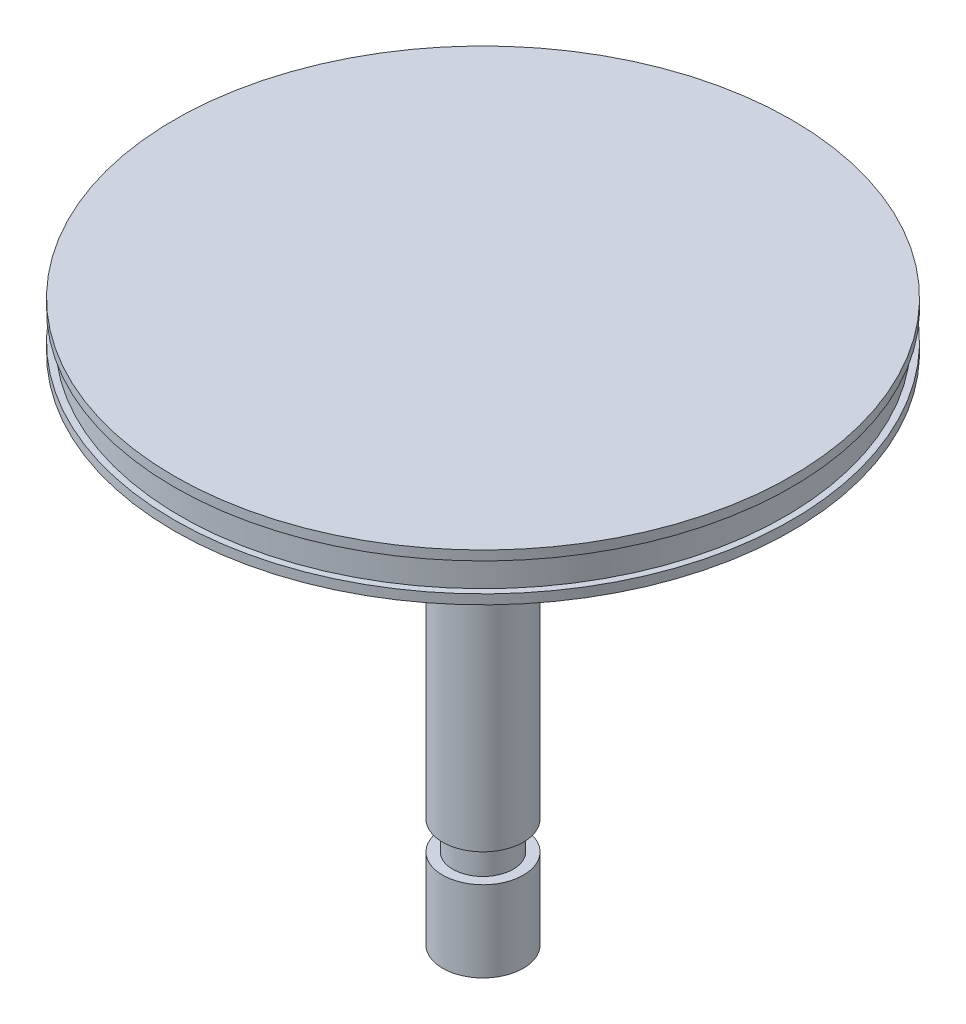
ISO-10303-21;
HEADER;
FILE_DESCRIPTION(('STEP AP214'),'2;1');
FILE_NAME('part.step','',(''),(''),'','','');
FILE_SCHEMA(('AUTOMOTIVE_DESIGN { 1 0 10303 214 1 1 1 1 }'));
ENDSEC;
DATA;
#1=APPLICATION_CONTEXT('core data for automotive mechanical design processes');
#2=APPLICATION_PROTOCOL_DEFINITION('international standard','automotive_design',2000,#1);
#3=PRODUCT_CONTEXT('',#1,'mechanical');
#4=PRODUCT('Part','Part','',(#3));
#5=PRODUCT_RELATED_PRODUCT_CATEGORY('part','',(#4));
#6=PRODUCT_DEFINITION_FORMATION('','',#4);
#7=PRODUCT_DEFINITION_CONTEXT('part definition',#1,'design');
#8=PRODUCT_DEFINITION('design','',#6,#7);
#9=PRODUCT_DEFINITION_SHAPE('','',#8);
#10=(LENGTH_UNIT() NAMED_UNIT(*) SI_UNIT(.MILLI.,.METRE.));
#11=(NAMED_UNIT(*) PLANE_ANGLE_UNIT() SI_UNIT($,.RADIAN.));
#12=(NAMED_UNIT(*) SI_UNIT($,.STERADIAN.) SOLID_ANGLE_UNIT());
#13=UNCERTAINTY_MEASURE_WITH_UNIT(LENGTH_MEASURE(1.E-05),#10,'distance_accuracy_value','');
#14=(GEOMETRIC_REPRESENTATION_CONTEXT(3) GLOBAL_UNCERTAINTY_ASSIGNED_CONTEXT((#13)) GLOBAL_UNIT_ASSIGNED_CONTEXT((#10,
#11,#12)) REPRESENTATION_CONTEXT('',''));
#15=CARTESIAN_POINT('',(0.,0.,0.));
#16=DIRECTION('',(0.,0.,1.));
#17=DIRECTION('',(1.,0.,0.));
#18=AXIS2_PLACEMENT_3D('',#15,#16,#17);
#19=CARTESIAN_POINT('',(0.,-113.,0.));
#20=DIRECTION('',(0.,1.,0.));
#21=DIRECTION('',(0.,0.,1.));
#22=AXIS2_PLACEMENT_3D('',#19,#20,#21);
#23=CYLINDRICAL_SURFACE('',#22,6.366);
#24=CARTESIAN_POINT('',(0.,-24.,0.));
#25=DIRECTION('',(0.,-1.,0.));
#26=DIRECTION('',(0.,0.,-1.));
#27=AXIS2_PLACEMENT_3D('',#24,#25,#26);
#28=CIRCLE('',#27,6.366);
#29=CARTESIAN_POINT('',(0.,-24.,-6.366));
#30=VERTEX_POINT('',#29);
#31=EDGE_CURVE('E47',#30,#30,#28,.T.);
#32=ORIENTED_EDGE('',*,*,#31,.T.);
#33=EDGE_LOOP('',(#32));
#34=FACE_BOUND('',#33,.T.);
#35=CARTESIAN_POINT('',(0.,-30.,0.));
#36=DIRECTION('',(0.,-1.,0.));
#37=DIRECTION('',(0.,0.,-1.));
#38=AXIS2_PLACEMENT_3D('',#35,#36,#37);
#39=CIRCLE('',#38,6.366);
#40=CARTESIAN_POINT('',(0.,-30.,-6.366));
#41=VERTEX_POINT('',#40);
#42=EDGE_CURVE('E10',#41,#41,#39,.T.);
#43=ORIENTED_EDGE('',*,*,#42,.F.);
#44=EDGE_LOOP('',(#43));
#45=FACE_BOUND('',#44,.T.);
#46=ADVANCED_FACE('F32',(#34,#45),#23,.T.);
#47=CARTESIAN_POINT('',(0.,5.,0.));
#48=DIRECTION('',(0.,-1.,0.));
#49=DIRECTION('',(0.,0.,-1.));
#50=AXIS2_PLACEMENT_3D('',#47,#48,#49);
#51=CYLINDRICAL_SURFACE('',#50,63.66);
#52=CARTESIAN_POINT('',(0.,-3.,0.));
#53=DIRECTION('',(0.,-1.,0.));
#54=DIRECTION('',(0.,0.,-1.));
#55=AXIS2_PLACEMENT_3D('',#52,#53,#54);
#56=CIRCLE('',#55,63.66);
#57=CARTESIAN_POINT('',(0.,-3.,-63.66));
#58=VERTEX_POINT('',#57);
#59=EDGE_CURVE('E57',#58,#58,#56,.T.);
#60=ORIENTED_EDGE('',*,*,#59,.F.);
#61=EDGE_LOOP('',(#60));
#62=FACE_BOUND('',#61,.T.);
#63=CARTESIAN_POINT('',(0.,3.,0.));
#64=DIRECTION('',(0.,1.,0.));
#65=DIRECTION('',(0.,0.,1.));
#66=AXIS2_PLACEMENT_3D('',#63,#64,#65);
#67=CIRCLE('',#66,63.66);
#68=CARTESIAN_POINT('',(0.,3.,63.66));
#69=VERTEX_POINT('',#68);
#70=EDGE_CURVE('E54',#69,#69,#67,.T.);
#71=ORIENTED_EDGE('',*,*,#70,.F.);
#72=EDGE_LOOP('',(#71));
#73=FACE_BOUND('',#72,.T.);
#74=ADVANCED_FACE('F34',(#62,#73),#51,.T.);
#75=CARTESIAN_POINT('',(0.,-3.,0.));
#76=DIRECTION('',(0.,-1.,0.));
#77=DIRECTION('',(0.,0.,-1.));
#78=AXIS2_PLACEMENT_3D('',#75,#76,#77);
#79=CYLINDRICAL_SURFACE('',#78,65.);
#80=CARTESIAN_POINT('',(0.,-3.,0.));
#81=DIRECTION('',(0.,-1.,0.));
#82=DIRECTION('',(0.,0.,-1.));
#83=AXIS2_PLACEMENT_3D('',#80,#81,#82);
#84=CIRCLE('',#83,65.);
#85=CARTESIAN_POINT('',(0.,-3.,-65.));
#86=VERTEX_POINT('',#85);
#87=EDGE_CURVE('E60',#86,#86,#84,.T.);
#88=ORIENTED_EDGE('',*,*,#87,.T.);
#89=EDGE_LOOP('',(#88));
#90=FACE_BOUND('',#89,.T.);
#91=CARTESIAN_POINT('',(0.,-5.,0.));
#92=DIRECTION('',(0.,-1.,0.));
#93=DIRECTION('',(0.,0.,-1.));
#94=AXIS2_PLACEMENT_3D('',#91,#92,#93);
#95=CIRCLE('',#94,65.);
#96=CARTESIAN_POINT('',(0.,-5.,-65.));
#97=VERTEX_POINT('',#96);
#98=EDGE_CURVE('E61',#97,#97,#95,.T.);
#99=ORIENTED_EDGE('',*,*,#98,.F.);
#100=EDGE_LOOP('',(#99));
#101=FACE_BOUND('',#100,.T.);
#102=ADVANCED_FACE('F118',(#90,#101),#79,.T.);
#103=CARTESIAN_POINT('',(0.,-3.,0.));
#104=DIRECTION('',(0.,-1.,0.));
#105=DIRECTION('',(0.,0.,-1.));
#106=AXIS2_PLACEMENT_3D('',#103,#104,#105);
#107=PLANE('',#106);
#108=ORIENTED_EDGE('',*,*,#59,.T.);
#109=EDGE_LOOP('',(#108));
#110=FACE_BOUND('',#109,.T.);
#111=ORIENTED_EDGE('',*,*,#87,.F.);
#112=EDGE_LOOP('',(#111));
#113=FACE_BOUND('',#112,.T.);
#114=ADVANCED_FACE('F252',(#110,#113),#107,.F.);
#115=CARTESIAN_POINT('',(0.,-5.,0.));
#116=DIRECTION('',(0.,1.,0.));
#117=DIRECTION('',(0.,0.,1.));
#118=AXIS2_PLACEMENT_3D('',#115,#116,#117);
#119=PLANE('',#118);
#120=CARTESIAN_POINT('',(0.,-5.,0.));
#121=DIRECTION('',(0.,1.,0.));
#122=DIRECTION('',(0.,0.,1.));
#123=AXIS2_PLACEMENT_3D('',#120,#121,#122);
#124=CIRCLE('',#123,10.);
#125=CARTESIAN_POINT('',(0.,-5.,10.));
#126=VERTEX_POINT('',#125);
#127=EDGE_CURVE('E40',#126,#126,#124,.F.);
#128=ORIENTED_EDGE('',*,*,#127,.F.);
#129=EDGE_LOOP('',(#128));
#130=FACE_BOUND('',#129,.T.);
#131=ORIENTED_EDGE('',*,*,#98,.T.);
#132=EDGE_LOOP('',(#131));
#133=FACE_BOUND('',#132,.T.);
#134=ADVANCED_FACE('F244',(#130,#133),#119,.F.);
#135=CARTESIAN_POINT('',(0.,3.,0.));
#136=DIRECTION('',(0.,1.,0.));
#137=DIRECTION('',(0.,0.,1.));
#138=AXIS2_PLACEMENT_3D('',#135,#136,#137);
#139=CYLINDRICAL_SURFACE('',#138,65.);
#140=CARTESIAN_POINT('',(0.,3.,0.));
#141=DIRECTION('',(0.,-1.,0.));
#142=DIRECTION('',(0.,0.,-1.));
#143=AXIS2_PLACEMENT_3D('',#140,#141,#142);
#144=CIRCLE('',#143,65.);
#145=CARTESIAN_POINT('',(0.,3.,-65.));
#146=VERTEX_POINT('',#145);
#147=EDGE_CURVE('E64',#146,#146,#144,.T.);
#148=ORIENTED_EDGE('',*,*,#147,.F.);
#149=EDGE_LOOP('',(#148));
#150=FACE_BOUND('',#149,.T.);
#151=CARTESIAN_POINT('',(0.,5.,0.));
#152=DIRECTION('',(0.,-1.,0.));
#153=DIRECTION('',(0.,0.,-1.));
#154=AXIS2_PLACEMENT_3D('',#151,#152,#153);
#155=CIRCLE('',#154,65.);
#156=CARTESIAN_POINT('',(0.,5.,-65.));
#157=VERTEX_POINT('',#156);
#158=EDGE_CURVE('E67',#157,#157,#155,.T.);
#159=ORIENTED_EDGE('',*,*,#158,.T.);
#160=EDGE_LOOP('',(#159));
#161=FACE_BOUND('',#160,.T.);
#162=ADVANCED_FACE('F237',(#150,#161),#139,.T.);
#163=CARTESIAN_POINT('',(0.,3.,0.));
#164=DIRECTION('',(0.,1.,0.));
#165=DIRECTION('',(0.,0.,-1.));
#166=AXIS2_PLACEMENT_3D('',#163,#164,#165);
#167=PLANE('',#166);
#168=ORIENTED_EDGE('',*,*,#70,.T.);
#169=EDGE_LOOP('',(#168));
#170=FACE_BOUND('',#169,.T.);
#171=ORIENTED_EDGE('',*,*,#147,.T.);
#172=EDGE_LOOP('',(#171));
#173=FACE_BOUND('',#172,.T.);
#174=ADVANCED_FACE('F232',(#170,#173),#167,.F.);
#175=CARTESIAN_POINT('',(0.,5.,0.));
#176=DIRECTION('',(0.,1.,0.));
#177=DIRECTION('',(0.,0.,1.));
#178=AXIS2_PLACEMENT_3D('',#175,#176,#177);
#179=PLANE('',#178);
#180=ORIENTED_EDGE('',*,*,#158,.F.);
#181=EDGE_LOOP('',(#180));
#182=FACE_BOUND('',#181,.T.);
#183=ADVANCED_FACE('F160',(#182),#179,.T.);
#184=CARTESIAN_POINT('',(0.,-7.,0.));
#185=DIRECTION('',(0.,1.,0.));
#186=DIRECTION('',(0.,0.,1.));
#187=AXIS2_PLACEMENT_3D('',#184,#185,#186);
#188=CYLINDRICAL_SURFACE('',#187,10.);
#189=CARTESIAN_POINT('',(0.,-7.,0.));
#190=DIRECTION('',(0.,-1.,0.));
#191=DIRECTION('',(0.,0.,-1.));
#192=AXIS2_PLACEMENT_3D('',#189,#190,#191);
#193=CIRCLE('',#192,10.);
#194=CARTESIAN_POINT('',(0.,-7.,-10.));
#195=VERTEX_POINT('',#194);
#196=EDGE_CURVE('E49',#195,#195,#193,.T.);
#197=ORIENTED_EDGE('',*,*,#196,.F.);
#198=EDGE_LOOP('',(#197));
#199=FACE_BOUND('',#198,.T.);
#200=ORIENTED_EDGE('',*,*,#127,.T.);
#201=EDGE_LOOP('',(#200));
#202=FACE_BOUND('',#201,.T.);
#203=ADVANCED_FACE('F138',(#199,#202),#188,.T.);
#204=CARTESIAN_POINT('',(0.,-7.,0.));
#205=DIRECTION('',(0.,-1.,0.));
#206=DIRECTION('',(0.,0.,-1.));
#207=AXIS2_PLACEMENT_3D('',#204,#205,#206);
#208=PLANE('',#207);
#209=CARTESIAN_POINT('',(0.,-7.,0.));
#210=DIRECTION('',(0.,-1.,0.));
#211=DIRECTION('',(0.,0.,-1.));
#212=AXIS2_PLACEMENT_3D('',#209,#210,#211);
#213=CIRCLE('',#212,8.5);
#214=CARTESIAN_POINT('',(0.,-7.,-8.5));
#215=VERTEX_POINT('',#214);
#216=EDGE_CURVE('E80',#215,#215,#213,.T.);
#217=ORIENTED_EDGE('',*,*,#216,.F.);
#218=EDGE_LOOP('',(#217));
#219=FACE_BOUND('',#218,.T.);
#220=ORIENTED_EDGE('',*,*,#196,.T.);
#221=EDGE_LOOP('',(#220));
#222=FACE_BOUND('',#221,.T.);
#223=ADVANCED_FACE('F179',(#219,#222),#208,.T.);
#224=CARTESIAN_POINT('',(0.,-24.,0.));
#225=DIRECTION('',(0.,1.,0.));
#226=DIRECTION('',(0.,0.,1.));
#227=AXIS2_PLACEMENT_3D('',#224,#225,#226);
#228=CYLINDRICAL_SURFACE('',#227,8.5);
#229=CARTESIAN_POINT('',(0.,-24.,0.));
#230=DIRECTION('',(0.,-1.,0.));
#231=DIRECTION('',(0.,0.,-1.));
#232=AXIS2_PLACEMENT_3D('',#229,#230,#231);
#233=CIRCLE('',#232,8.5);
#234=CARTESIAN_POINT('',(0.,-24.,-8.5));
#235=VERTEX_POINT('',#234);
#236=EDGE_CURVE('E50',#235,#235,#233,.T.);
#237=ORIENTED_EDGE('',*,*,#236,.F.);
#238=EDGE_LOOP('',(#237));
#239=FACE_BOUND('',#238,.T.);
#240=ORIENTED_EDGE('',*,*,#216,.T.);
#241=EDGE_LOOP('',(#240));
#242=FACE_BOUND('',#241,.T.);
#243=ADVANCED_FACE('F187',(#239,#242),#228,.T.);
#244=CARTESIAN_POINT('',(0.,-24.,0.));
#245=DIRECTION('',(0.,-1.,0.));
#246=DIRECTION('',(0.,0.,-1.));
#247=AXIS2_PLACEMENT_3D('',#244,#245,#246);
#248=PLANE('',#247);
#249=ORIENTED_EDGE('',*,*,#31,.F.);
#250=EDGE_LOOP('',(#249));
#251=FACE_BOUND('',#250,.T.);
#252=ORIENTED_EDGE('',*,*,#236,.T.);
#253=EDGE_LOOP('',(#252));
#254=FACE_BOUND('',#253,.T.);
#255=ADVANCED_FACE('F109',(#251,#254),#248,.T.);
#256=CARTESIAN_POINT('',(0.,-90.,0.));
#257=DIRECTION('',(0.,1.,0.));
#258=DIRECTION('',(0.,0.,1.));
#259=AXIS2_PLACEMENT_3D('',#256,#257,#258);
#260=CYLINDRICAL_SURFACE('',#259,8.5);
#261=CARTESIAN_POINT('',(0.,-90.,0.));
#262=DIRECTION('',(0.,-1.,0.));
#263=DIRECTION('',(0.,0.,-1.));
#264=AXIS2_PLACEMENT_3D('',#261,#262,#263);
#265=CIRCLE('',#264,8.5);
#266=CARTESIAN_POINT('',(0.,-90.,-8.5));
#267=VERTEX_POINT('',#266);
#268=EDGE_CURVE('E88',#267,#267,#265,.T.);
#269=ORIENTED_EDGE('',*,*,#268,.F.);
#270=EDGE_LOOP('',(#269));
#271=FACE_BOUND('',#270,.T.);
#272=CARTESIAN_POINT('',(0.,-30.,0.));
#273=DIRECTION('',(0.,-1.,0.));
#274=DIRECTION('',(0.,0.,-1.));
#275=AXIS2_PLACEMENT_3D('',#272,#273,#274);
#276=CIRCLE('',#275,8.5);
#277=CARTESIAN_POINT('',(0.,-30.,-8.5));
#278=VERTEX_POINT('',#277);
#279=EDGE_CURVE('E85',#278,#278,#276,.T.);
#280=ORIENTED_EDGE('',*,*,#279,.T.);
#281=EDGE_LOOP('',(#280));
#282=FACE_BOUND('',#281,.T.);
#283=ADVANCED_FACE('F101',(#271,#282),#260,.T.);
#284=CARTESIAN_POINT('',(0.,-90.,0.));
#285=DIRECTION('',(0.,-1.,0.));
#286=DIRECTION('',(0.,0.,-1.));
#287=AXIS2_PLACEMENT_3D('',#284,#285,#286);
#288=PLANE('',#287);
#289=CARTESIAN_POINT('',(0.,-90.,0.));
#290=DIRECTION('',(0.,-1.,0.));
#291=DIRECTION('',(0.,0.,-1.));
#292=AXIS2_PLACEMENT_3D('',#289,#290,#291);
#293=CIRCLE('',#292,6.366);
#294=CARTESIAN_POINT('',(0.,-90.,-6.366));
#295=VERTEX_POINT('',#294);
#296=EDGE_CURVE('E36',#295,#295,#293,.T.);
#297=ORIENTED_EDGE('',*,*,#296,.F.);
#298=EDGE_LOOP('',(#297));
#299=FACE_BOUND('',#298,.T.);
#300=ORIENTED_EDGE('',*,*,#268,.T.);
#301=EDGE_LOOP('',(#300));
#302=FACE_BOUND('',#301,.T.);
#303=ADVANCED_FACE('F98',(#299,#302),#288,.T.);
#304=CARTESIAN_POINT('',(0.,-30.,0.));
#305=DIRECTION('',(0.,-1.,0.));
#306=DIRECTION('',(0.,0.,-1.));
#307=AXIS2_PLACEMENT_3D('',#304,#305,#306);
#308=PLANE('',#307);
#309=ORIENTED_EDGE('',*,*,#42,.T.);
#310=EDGE_LOOP('',(#309));
#311=FACE_BOUND('',#310,.T.);
#312=ORIENTED_EDGE('',*,*,#279,.F.);
#313=EDGE_LOOP('',(#312));
#314=FACE_BOUND('',#313,.T.);
#315=ADVANCED_FACE('F100',(#311,#314),#308,.F.);
#316=CARTESIAN_POINT('',(0.,-113.,0.));
#317=DIRECTION('',(0.,-1.,0.));
#318=DIRECTION('',(0.,0.,-1.));
#319=AXIS2_PLACEMENT_3D('',#316,#317,#318);
#320=PLANE('',#319);
#321=CARTESIAN_POINT('',(0.,-113.,0.));
#322=DIRECTION('',(0.,-1.,0.));
#323=DIRECTION('',(0.,0.,-1.));
#324=AXIS2_PLACEMENT_3D('',#321,#322,#323);
#325=CIRCLE('',#324,8.5);
#326=CARTESIAN_POINT('',(0.,-113.,-8.5));
#327=VERTEX_POINT('',#326);
#328=EDGE_CURVE('E73',#327,#327,#325,.T.);
#329=ORIENTED_EDGE('',*,*,#328,.T.);
#330=EDGE_LOOP('',(#329));
#331=FACE_BOUND('',#330,.T.);
#332=ADVANCED_FACE('F107',(#331),#320,.T.);
#333=CARTESIAN_POINT('',(0.,-96.,0.));
#334=DIRECTION('',(0.,-1.,0.));
#335=DIRECTION('',(0.,0.,-1.));
#336=AXIS2_PLACEMENT_3D('',#333,#334,#335);
#337=CYLINDRICAL_SURFACE('',#336,8.5);
#338=CARTESIAN_POINT('',(0.,-96.,0.));
#339=DIRECTION('',(0.,-1.,0.));
#340=DIRECTION('',(0.,0.,-1.));
#341=AXIS2_PLACEMENT_3D('',#338,#339,#340);
#342=CIRCLE('',#341,8.5);
#343=CARTESIAN_POINT('',(0.,-96.,-8.5));
#344=VERTEX_POINT('',#343);
#345=EDGE_CURVE('E70',#344,#344,#342,.T.);
#346=ORIENTED_EDGE('',*,*,#345,.T.);
#347=EDGE_LOOP('',(#346));
#348=FACE_BOUND('',#347,.T.);
#349=ORIENTED_EDGE('',*,*,#328,.F.);
#350=EDGE_LOOP('',(#349));
#351=FACE_BOUND('',#350,.T.);
#352=ADVANCED_FACE('F128',(#348,#351),#337,.T.);
#353=CARTESIAN_POINT('',(0.,-96.,0.));
#354=DIRECTION('',(0.,-1.,0.));
#355=DIRECTION('',(0.,0.,-1.));
#356=AXIS2_PLACEMENT_3D('',#353,#354,#355);
#357=PLANE('',#356);
#358=CARTESIAN_POINT('',(0.,-96.,0.));
#359=DIRECTION('',(0.,-1.,0.));
#360=DIRECTION('',(0.,0.,-1.));
#361=AXIS2_PLACEMENT_3D('',#358,#359,#360);
#362=CIRCLE('',#361,6.366);
#363=CARTESIAN_POINT('',(0.,-96.,-6.366));
#364=VERTEX_POINT('',#363);
#365=EDGE_CURVE('E44',#364,#364,#362,.T.);
#366=ORIENTED_EDGE('',*,*,#365,.T.);
#367=EDGE_LOOP('',(#366));
#368=FACE_BOUND('',#367,.T.);
#369=ORIENTED_EDGE('',*,*,#345,.F.);
#370=EDGE_LOOP('',(#369));
#371=FACE_BOUND('',#370,.T.);
#372=ADVANCED_FACE('F124',(#368,#371),#357,.F.);
#373=ORIENTED_EDGE('',*,*,#296,.T.);
#374=EDGE_LOOP('',(#373));
#375=FACE_BOUND('',#374,.T.);
#376=ORIENTED_EDGE('',*,*,#365,.F.);
#377=EDGE_LOOP('',(#376));
#378=FACE_BOUND('',#377,.T.);
#379=ADVANCED_FACE('F95',(#375,#378),#23,.T.);
#380=CLOSED_SHELL('',(#46,#74,#102,#114,#134,#162,#174,#183,#203,#223,#243,#255,#283,#303,#315,
#332,#352,#372,#379));
#381=MANIFOLD_SOLID_BREP('B2',#380);
#382=ADVANCED_BREP_SHAPE_REPRESENTATION('',(#18,#381),#14);
#383=SHAPE_DEFINITION_REPRESENTATION(#9,#382);
ENDSEC;
END-ISO-10303-21;
